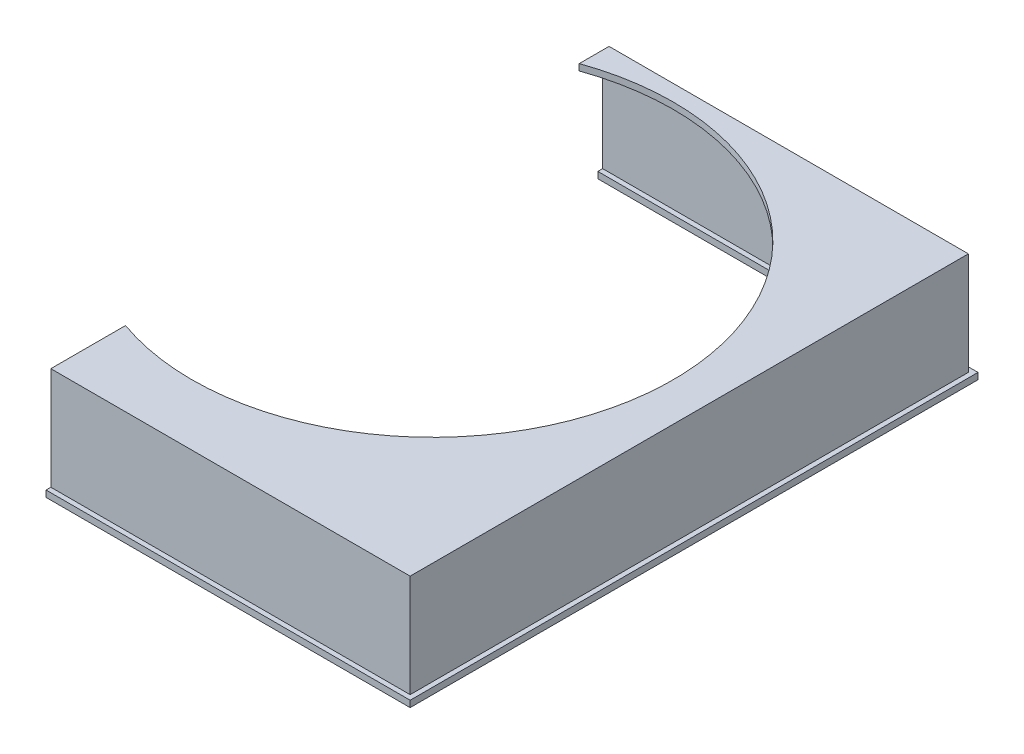
ISO-10303-21;
HEADER;
FILE_DESCRIPTION(('STEP AP214'),'2;1');
FILE_NAME('part.step','',(''),(''),'','','');
FILE_SCHEMA(('AUTOMOTIVE_DESIGN { 1 0 10303 214 1 1 1 1 }'));
ENDSEC;
DATA;
#1=APPLICATION_CONTEXT('core data for automotive mechanical design processes');
#2=APPLICATION_PROTOCOL_DEFINITION('international standard','automotive_design',2000,#1);
#3=PRODUCT_CONTEXT('',#1,'mechanical');
#4=PRODUCT('Part','Part','',(#3));
#5=PRODUCT_RELATED_PRODUCT_CATEGORY('part','',(#4));
#6=PRODUCT_DEFINITION_FORMATION('','',#4);
#7=PRODUCT_DEFINITION_CONTEXT('part definition',#1,'design');
#8=PRODUCT_DEFINITION('design','',#6,#7);
#9=PRODUCT_DEFINITION_SHAPE('','',#8);
#10=(LENGTH_UNIT() NAMED_UNIT(*) SI_UNIT(.MILLI.,.METRE.));
#11=(NAMED_UNIT(*) PLANE_ANGLE_UNIT() SI_UNIT($,.RADIAN.));
#12=(NAMED_UNIT(*) SI_UNIT($,.STERADIAN.) SOLID_ANGLE_UNIT());
#13=UNCERTAINTY_MEASURE_WITH_UNIT(LENGTH_MEASURE(1.E-05),#10,'distance_accuracy_value','');
#14=(GEOMETRIC_REPRESENTATION_CONTEXT(3) GLOBAL_UNCERTAINTY_ASSIGNED_CONTEXT((#13)) GLOBAL_UNIT_ASSIGNED_CONTEXT((#10,
#11,#12)) REPRESENTATION_CONTEXT('',''));
#15=CARTESIAN_POINT('',(0.,0.,0.));
#16=DIRECTION('',(0.,0.,1.));
#17=DIRECTION('',(1.,0.,0.));
#18=AXIS2_PLACEMENT_3D('',#15,#16,#17);
#19=CARTESIAN_POINT('',(0.,32.,170.));
#20=DIRECTION('',(0.,0.,-1.));
#21=DIRECTION('',(-1.,0.,0.));
#22=AXIS2_PLACEMENT_3D('',#19,#20,#21);
#23=PLANE('',#22);
#24=DIRECTION('',(0.,-1.,0.));
#25=VECTOR('',#24,1.);
#26=CARTESIAN_POINT('',(110.,32.,170.));
#27=LINE('',#26,#25);
#28=CARTESIAN_POINT('',(110.,30.,170.));
#29=VERTEX_POINT('',#28);
#30=CARTESIAN_POINT('',(110.,0.,170.));
#31=VERTEX_POINT('',#30);
#32=EDGE_CURVE('E312',#29,#31,#27,.T.);
#33=ORIENTED_EDGE('',*,*,#32,.F.);
#34=DIRECTION('',(1.,0.,0.));
#35=VECTOR('',#34,1.);
#36=CARTESIAN_POINT('',(-2.,30.,170.));
#37=LINE('',#36,#35);
#38=CARTESIAN_POINT('',(220.,30.,170.));
#39=VERTEX_POINT('',#38);
#40=EDGE_CURVE('E260',#29,#39,#37,.T.);
#41=ORIENTED_EDGE('',*,*,#40,.T.);
#42=DIRECTION('',(0.,-1.,0.));
#43=VECTOR('',#42,1.);
#44=CARTESIAN_POINT('',(220.,32.,170.));
#45=LINE('',#44,#43);
#46=CARTESIAN_POINT('',(220.,0.,170.));
#47=VERTEX_POINT('',#46);
#48=EDGE_CURVE('E218',#39,#47,#45,.T.);
#49=ORIENTED_EDGE('',*,*,#48,.T.);
#50=DIRECTION('',(1.,0.,0.));
#51=VECTOR('',#50,1.);
#52=CARTESIAN_POINT('',(0.,0.,170.));
#53=LINE('',#52,#51);
#54=EDGE_CURVE('E207',#31,#47,#53,.T.);
#55=ORIENTED_EDGE('',*,*,#54,.F.);
#56=EDGE_LOOP('',(#33,#41,#49,#55));
#57=FACE_BOUND('',#56,.T.);
#58=ADVANCED_FACE('F39',(#57),#23,.T.);
#59=CARTESIAN_POINT('',(220.,32.,0.));
#60=DIRECTION('',(-1.,0.,0.));
#61=DIRECTION('',(0.,0.,1.));
#62=AXIS2_PLACEMENT_3D('',#59,#60,#61);
#63=PLANE('',#62);
#64=ORIENTED_EDGE('',*,*,#48,.F.);
#65=DIRECTION('',(0.,0.,-1.));
#66=VECTOR('',#65,1.);
#67=CARTESIAN_POINT('',(220.,30.,-2.));
#68=LINE('',#67,#66);
#69=CARTESIAN_POINT('',(220.,30.,0.));
#70=VERTEX_POINT('',#69);
#71=EDGE_CURVE('E267',#39,#70,#68,.T.);
#72=ORIENTED_EDGE('',*,*,#71,.T.);
#73=DIRECTION('',(0.,-1.,0.));
#74=VECTOR('',#73,1.);
#75=CARTESIAN_POINT('',(220.,32.,0.));
#76=LINE('',#75,#74);
#77=CARTESIAN_POINT('',(220.,0.,0.));
#78=VERTEX_POINT('',#77);
#79=EDGE_CURVE('E216',#70,#78,#76,.T.);
#80=ORIENTED_EDGE('',*,*,#79,.T.);
#81=DIRECTION('',(0.,0.,-1.));
#82=VECTOR('',#81,1.);
#83=CARTESIAN_POINT('',(220.,0.,0.));
#84=LINE('',#83,#82);
#85=EDGE_CURVE('E210',#47,#78,#84,.T.);
#86=ORIENTED_EDGE('',*,*,#85,.F.);
#87=EDGE_LOOP('',(#64,#72,#80,#86));
#88=FACE_BOUND('',#87,.T.);
#89=ADVANCED_FACE('F354',(#88),#63,.T.);
#90=CARTESIAN_POINT('',(0.,32.,0.));
#91=DIRECTION('',(0.,0.,1.));
#92=DIRECTION('',(1.,0.,0.));
#93=AXIS2_PLACEMENT_3D('',#90,#91,#92);
#94=PLANE('',#93);
#95=DIRECTION('',(0.,1.,0.));
#96=VECTOR('',#95,1.);
#97=CARTESIAN_POINT('',(110.,32.,0.));
#98=LINE('',#97,#96);
#99=CARTESIAN_POINT('',(110.,0.,0.));
#100=VERTEX_POINT('',#99);
#101=CARTESIAN_POINT('',(110.,30.,0.));
#102=VERTEX_POINT('',#101);
#103=EDGE_CURVE('E304',#100,#102,#98,.T.);
#104=ORIENTED_EDGE('',*,*,#103,.F.);
#105=DIRECTION('',(-1.,0.,0.));
#106=VECTOR('',#105,1.);
#107=CARTESIAN_POINT('',(0.,0.,0.));
#108=LINE('',#107,#106);
#109=EDGE_CURVE('E213',#78,#100,#108,.T.);
#110=ORIENTED_EDGE('',*,*,#109,.F.);
#111=ORIENTED_EDGE('',*,*,#79,.F.);
#112=DIRECTION('',(-1.,0.,0.));
#113=VECTOR('',#112,1.);
#114=CARTESIAN_POINT('',(0.,30.,0.));
#115=LINE('',#114,#113);
#116=EDGE_CURVE('E242',#70,#102,#115,.T.);
#117=ORIENTED_EDGE('',*,*,#116,.T.);
#118=EDGE_LOOP('',(#104,#110,#111,#117));
#119=FACE_BOUND('',#118,.T.);
#120=ADVANCED_FACE('F351',(#119),#94,.T.);
#121=CARTESIAN_POINT('',(0.,32.,0.));
#122=DIRECTION('',(0.,1.,0.));
#123=DIRECTION('',(0.,0.,1.));
#124=AXIS2_PLACEMENT_3D('',#121,#122,#123);
#125=PLANE('',#124);
#126=DIRECTION('',(0.,0.,-1.));
#127=VECTOR('',#126,1.);
#128=CARTESIAN_POINT('',(110.,32.,-3.5));
#129=LINE('',#128,#127);
#130=CARTESIAN_POINT('',(110.,32.,172.));
#131=VERTEX_POINT('',#130);
#132=CARTESIAN_POINT('',(110.,32.,148.710678118655));
#133=VERTEX_POINT('',#132);
#134=EDGE_CURVE('E54',#131,#133,#129,.T.);
#135=ORIENTED_EDGE('',*,*,#134,.F.);
#136=DIRECTION('',(1.,0.,0.));
#137=VECTOR('',#136,1.);
#138=CARTESIAN_POINT('',(-2.,32.,172.));
#139=LINE('',#138,#137);
#140=CARTESIAN_POINT('',(222.,32.,172.));
#141=VERTEX_POINT('',#140);
#142=EDGE_CURVE('E222',#131,#141,#139,.T.);
#143=ORIENTED_EDGE('',*,*,#142,.T.);
#144=DIRECTION('',(0.,0.,-1.));
#145=VECTOR('',#144,1.);
#146=CARTESIAN_POINT('',(222.,32.,-2.));
#147=LINE('',#146,#145);
#148=CARTESIAN_POINT('',(222.,32.,-2.));
#149=VERTEX_POINT('',#148);
#150=EDGE_CURVE('E224',#141,#149,#147,.T.);
#151=ORIENTED_EDGE('',*,*,#150,.T.);
#152=DIRECTION('',(-1.,0.,0.));
#153=VECTOR('',#152,1.);
#154=CARTESIAN_POINT('',(-2.,32.,-2.));
#155=LINE('',#154,#153);
#156=CARTESIAN_POINT('',(110.,32.,-2.));
#157=VERTEX_POINT('',#156);
#158=EDGE_CURVE('E227',#149,#157,#155,.T.);
#159=ORIENTED_EDGE('',*,*,#158,.T.);
#160=CARTESIAN_POINT('',(110.,32.,7.28932188134522));
#161=VERTEX_POINT('',#160);
#162=EDGE_CURVE('E257',#161,#157,#129,.T.);
#163=ORIENTED_EDGE('',*,*,#162,.F.);
#164=CARTESIAN_POINT('',(135.,32.,78.));
#165=DIRECTION('',(0.,1.,0.));
#166=DIRECTION('',(0.,0.,1.));
#167=AXIS2_PLACEMENT_3D('',#164,#165,#166);
#168=CIRCLE('',#167,75.);
#169=EDGE_CURVE('E249',#133,#161,#168,.T.);
#170=ORIENTED_EDGE('',*,*,#169,.F.);
#171=EDGE_LOOP('',(#135,#143,#151,#159,#163,#170));
#172=FACE_BOUND('',#171,.T.);
#173=ADVANCED_FACE('F255',(#172),#125,.T.);
#174=CARTESIAN_POINT('',(-2.,32.,172.));
#175=DIRECTION('',(0.,0.,-1.));
#176=DIRECTION('',(-1.,0.,0.));
#177=AXIS2_PLACEMENT_3D('',#174,#175,#176);
#178=PLANE('',#177);
#179=ORIENTED_EDGE('',*,*,#142,.F.);
#180=DIRECTION('',(0.,-1.,0.));
#181=VECTOR('',#180,1.);
#182=CARTESIAN_POINT('',(110.,32.,172.));
#183=LINE('',#182,#181);
#184=CARTESIAN_POINT('',(110.,0.,172.));
#185=VERTEX_POINT('',#184);
#186=EDGE_CURVE('E258',#131,#185,#183,.T.);
#187=ORIENTED_EDGE('',*,*,#186,.T.);
#188=DIRECTION('',(1.,0.,0.));
#189=VECTOR('',#188,1.);
#190=CARTESIAN_POINT('',(-2.,0.,172.));
#191=LINE('',#190,#189);
#192=CARTESIAN_POINT('',(222.,0.,172.));
#193=VERTEX_POINT('',#192);
#194=EDGE_CURVE('E221',#185,#193,#191,.T.);
#195=ORIENTED_EDGE('',*,*,#194,.T.);
#196=DIRECTION('',(0.,-1.,0.));
#197=VECTOR('',#196,1.);
#198=CARTESIAN_POINT('',(222.,32.,172.));
#199=LINE('',#198,#197);
#200=EDGE_CURVE('E239',#141,#193,#199,.T.);
#201=ORIENTED_EDGE('',*,*,#200,.F.);
#202=EDGE_LOOP('',(#179,#187,#195,#201));
#203=FACE_BOUND('',#202,.T.);
#204=ADVANCED_FACE('F41',(#203),#178,.F.);
#205=CARTESIAN_POINT('',(222.,32.,-2.));
#206=DIRECTION('',(-1.,0.,0.));
#207=DIRECTION('',(0.,0.,1.));
#208=AXIS2_PLACEMENT_3D('',#205,#206,#207);
#209=PLANE('',#208);
#210=DIRECTION('',(0.,0.,-1.));
#211=VECTOR('',#210,1.);
#212=CARTESIAN_POINT('',(222.,0.,-2.));
#213=LINE('',#212,#211);
#214=CARTESIAN_POINT('',(222.,0.,-2.));
#215=VERTEX_POINT('',#214);
#216=EDGE_CURVE('E232',#193,#215,#213,.T.);
#217=ORIENTED_EDGE('',*,*,#216,.T.);
#218=DIRECTION('',(0.,-1.,0.));
#219=VECTOR('',#218,1.);
#220=CARTESIAN_POINT('',(222.,32.,-2.));
#221=LINE('',#220,#219);
#222=EDGE_CURVE('E230',#149,#215,#221,.T.);
#223=ORIENTED_EDGE('',*,*,#222,.F.);
#224=ORIENTED_EDGE('',*,*,#150,.F.);
#225=ORIENTED_EDGE('',*,*,#200,.T.);
#226=EDGE_LOOP('',(#217,#223,#224,#225));
#227=FACE_BOUND('',#226,.T.);
#228=ADVANCED_FACE('F342',(#227),#209,.F.);
#229=CARTESIAN_POINT('',(-2.,32.,-2.));
#230=DIRECTION('',(0.,0.,1.));
#231=DIRECTION('',(1.,0.,0.));
#232=AXIS2_PLACEMENT_3D('',#229,#230,#231);
#233=PLANE('',#232);
#234=DIRECTION('',(-1.,0.,0.));
#235=VECTOR('',#234,1.);
#236=CARTESIAN_POINT('',(-2.,0.,-2.));
#237=LINE('',#236,#235);
#238=CARTESIAN_POINT('',(110.,0.,-2.));
#239=VERTEX_POINT('',#238);
#240=EDGE_CURVE('E225',#215,#239,#237,.T.);
#241=ORIENTED_EDGE('',*,*,#240,.T.);
#242=DIRECTION('',(0.,1.,0.));
#243=VECTOR('',#242,1.);
#244=CARTESIAN_POINT('',(110.,32.,-2.));
#245=LINE('',#244,#243);
#246=EDGE_CURVE('E332',#239,#157,#245,.T.);
#247=ORIENTED_EDGE('',*,*,#246,.T.);
#248=ORIENTED_EDGE('',*,*,#158,.F.);
#249=ORIENTED_EDGE('',*,*,#222,.T.);
#250=EDGE_LOOP('',(#241,#247,#248,#249));
#251=FACE_BOUND('',#250,.T.);
#252=ADVANCED_FACE('F337',(#251),#233,.F.);
#253=CARTESIAN_POINT('',(0.,0.,0.));
#254=DIRECTION('',(0.,1.,0.));
#255=DIRECTION('',(0.,0.,1.));
#256=AXIS2_PLACEMENT_3D('',#253,#254,#255);
#257=PLANE('',#256);
#258=DIRECTION('',(0.,0.,-1.));
#259=VECTOR('',#258,1.);
#260=CARTESIAN_POINT('',(110.,0.,0.));
#261=LINE('',#260,#259);
#262=CARTESIAN_POINT('',(110.,0.,173.5));
#263=VERTEX_POINT('',#262);
#264=EDGE_CURVE('E263',#263,#185,#261,.T.);
#265=ORIENTED_EDGE('',*,*,#264,.F.);
#266=DIRECTION('',(1.,0.,0.));
#267=VECTOR('',#266,1.);
#268=CARTESIAN_POINT('',(-3.5,0.,173.5));
#269=LINE('',#268,#267);
#270=CARTESIAN_POINT('',(223.5,0.,173.5));
#271=VERTEX_POINT('',#270);
#272=EDGE_CURVE('E179',#263,#271,#269,.T.);
#273=ORIENTED_EDGE('',*,*,#272,.T.);
#274=DIRECTION('',(0.,0.,-1.));
#275=VECTOR('',#274,1.);
#276=CARTESIAN_POINT('',(223.5,0.,-3.5));
#277=LINE('',#276,#275);
#278=CARTESIAN_POINT('',(223.5,0.,-3.5));
#279=VERTEX_POINT('',#278);
#280=EDGE_CURVE('E192',#271,#279,#277,.T.);
#281=ORIENTED_EDGE('',*,*,#280,.T.);
#282=DIRECTION('',(-1.,0.,0.));
#283=VECTOR('',#282,1.);
#284=CARTESIAN_POINT('',(-3.5,0.,-3.5));
#285=LINE('',#284,#283);
#286=CARTESIAN_POINT('',(110.,0.,-3.5));
#287=VERTEX_POINT('',#286);
#288=EDGE_CURVE('E187',#279,#287,#285,.T.);
#289=ORIENTED_EDGE('',*,*,#288,.T.);
#290=EDGE_CURVE('E307',#239,#287,#261,.T.);
#291=ORIENTED_EDGE('',*,*,#290,.F.);
#292=ORIENTED_EDGE('',*,*,#240,.F.);
#293=ORIENTED_EDGE('',*,*,#216,.F.);
#294=ORIENTED_EDGE('',*,*,#194,.F.);
#295=EDGE_LOOP('',(#265,#273,#281,#289,#291,#292,#293,#294));
#296=FACE_BOUND('',#295,.T.);
#297=ADVANCED_FACE('F328',(#296),#257,.T.);
#298=CARTESIAN_POINT('',(-3.5,-2.,-3.5));
#299=DIRECTION('',(0.,0.,-1.));
#300=DIRECTION('',(-1.,0.,0.));
#301=AXIS2_PLACEMENT_3D('',#298,#299,#300);
#302=PLANE('',#301);
#303=DIRECTION('',(0.,1.,0.));
#304=VECTOR('',#303,1.);
#305=CARTESIAN_POINT('',(110.,-2.,-3.5));
#306=LINE('',#305,#304);
#307=CARTESIAN_POINT('',(110.,-2.,-3.5));
#308=VERTEX_POINT('',#307);
#309=EDGE_CURVE('E180',#308,#287,#306,.T.);
#310=ORIENTED_EDGE('',*,*,#309,.T.);
#311=ORIENTED_EDGE('',*,*,#288,.F.);
#312=DIRECTION('',(0.,1.,0.));
#313=VECTOR('',#312,1.);
#314=CARTESIAN_POINT('',(223.5,-2.,-3.5));
#315=LINE('',#314,#313);
#316=CARTESIAN_POINT('',(223.5,-2.,-3.5));
#317=VERTEX_POINT('',#316);
#318=EDGE_CURVE('E205',#317,#279,#315,.T.);
#319=ORIENTED_EDGE('',*,*,#318,.F.);
#320=DIRECTION('',(-1.,0.,0.));
#321=VECTOR('',#320,1.);
#322=CARTESIAN_POINT('',(-3.5,-2.,-3.5));
#323=LINE('',#322,#321);
#324=EDGE_CURVE('E189',#317,#308,#323,.T.);
#325=ORIENTED_EDGE('',*,*,#324,.T.);
#326=EDGE_LOOP('',(#310,#311,#319,#325));
#327=FACE_BOUND('',#326,.T.);
#328=ADVANCED_FACE('F322',(#327),#302,.T.);
#329=CARTESIAN_POINT('',(223.5,-2.,-3.5));
#330=DIRECTION('',(1.,0.,0.));
#331=DIRECTION('',(0.,0.,-1.));
#332=AXIS2_PLACEMENT_3D('',#329,#330,#331);
#333=PLANE('',#332);
#334=ORIENTED_EDGE('',*,*,#280,.F.);
#335=DIRECTION('',(0.,1.,0.));
#336=VECTOR('',#335,1.);
#337=CARTESIAN_POINT('',(223.5,-2.,173.5));
#338=LINE('',#337,#336);
#339=CARTESIAN_POINT('',(223.5,-2.,173.5));
#340=VERTEX_POINT('',#339);
#341=EDGE_CURVE('E200',#340,#271,#338,.T.);
#342=ORIENTED_EDGE('',*,*,#341,.F.);
#343=DIRECTION('',(0.,0.,-1.));
#344=VECTOR('',#343,1.);
#345=CARTESIAN_POINT('',(223.5,-2.,-3.5));
#346=LINE('',#345,#344);
#347=EDGE_CURVE('E186',#340,#317,#346,.T.);
#348=ORIENTED_EDGE('',*,*,#347,.T.);
#349=ORIENTED_EDGE('',*,*,#318,.T.);
#350=EDGE_LOOP('',(#334,#342,#348,#349));
#351=FACE_BOUND('',#350,.T.);
#352=ADVANCED_FACE('F326',(#351),#333,.T.);
#353=CARTESIAN_POINT('',(-3.5,-2.,173.5));
#354=DIRECTION('',(0.,0.,1.));
#355=DIRECTION('',(1.,0.,0.));
#356=AXIS2_PLACEMENT_3D('',#353,#354,#355);
#357=PLANE('',#356);
#358=DIRECTION('',(0.,1.,0.));
#359=VECTOR('',#358,1.);
#360=CARTESIAN_POINT('',(110.,-2.,173.5));
#361=LINE('',#360,#359);
#362=CARTESIAN_POINT('',(110.,-2.,173.5));
#363=VERTEX_POINT('',#362);
#364=EDGE_CURVE('E164',#363,#263,#361,.T.);
#365=ORIENTED_EDGE('',*,*,#364,.F.);
#366=DIRECTION('',(1.,0.,0.));
#367=VECTOR('',#366,1.);
#368=CARTESIAN_POINT('',(-3.5,-2.,173.5));
#369=LINE('',#368,#367);
#370=EDGE_CURVE('E177',#363,#340,#369,.T.);
#371=ORIENTED_EDGE('',*,*,#370,.T.);
#372=ORIENTED_EDGE('',*,*,#341,.T.);
#373=ORIENTED_EDGE('',*,*,#272,.F.);
#374=EDGE_LOOP('',(#365,#371,#372,#373));
#375=FACE_BOUND('',#374,.T.);
#376=ADVANCED_FACE('F175',(#375),#357,.T.);
#377=CARTESIAN_POINT('',(0.,-2.,0.));
#378=DIRECTION('',(0.,1.,0.));
#379=DIRECTION('',(0.,0.,1.));
#380=AXIS2_PLACEMENT_3D('',#377,#378,#379);
#381=PLANE('',#380);
#382=ORIENTED_EDGE('',*,*,#370,.F.);
#383=DIRECTION('',(0.,0.,-1.));
#384=VECTOR('',#383,1.);
#385=CARTESIAN_POINT('',(110.,-2.,-3.5));
#386=LINE('',#385,#384);
#387=CARTESIAN_POINT('',(110.,-2.,168.5));
#388=VERTEX_POINT('',#387);
#389=EDGE_CURVE('E161',#363,#388,#386,.T.);
#390=ORIENTED_EDGE('',*,*,#389,.T.);
#391=DIRECTION('',(1.,0.,0.));
#392=VECTOR('',#391,1.);
#393=CARTESIAN_POINT('',(218.5,-2.,168.5));
#394=LINE('',#393,#392);
#395=CARTESIAN_POINT('',(218.5,-2.,168.5));
#396=VERTEX_POINT('',#395);
#397=EDGE_CURVE('E278',#388,#396,#394,.T.);
#398=ORIENTED_EDGE('',*,*,#397,.T.);
#399=DIRECTION('',(0.,0.,-1.));
#400=VECTOR('',#399,1.);
#401=CARTESIAN_POINT('',(218.5,-2.,168.5));
#402=LINE('',#401,#400);
#403=CARTESIAN_POINT('',(218.5,-2.,1.5));
#404=VERTEX_POINT('',#403);
#405=EDGE_CURVE('E271',#396,#404,#402,.T.);
#406=ORIENTED_EDGE('',*,*,#405,.T.);
#407=DIRECTION('',(-1.,0.,0.));
#408=VECTOR('',#407,1.);
#409=CARTESIAN_POINT('',(218.5,-2.,1.5));
#410=LINE('',#409,#408);
#411=CARTESIAN_POINT('',(110.,-2.,1.5));
#412=VERTEX_POINT('',#411);
#413=EDGE_CURVE('E274',#404,#412,#410,.T.);
#414=ORIENTED_EDGE('',*,*,#413,.T.);
#415=EDGE_CURVE('E171',#412,#308,#386,.T.);
#416=ORIENTED_EDGE('',*,*,#415,.T.);
#417=ORIENTED_EDGE('',*,*,#324,.F.);
#418=ORIENTED_EDGE('',*,*,#347,.F.);
#419=EDGE_LOOP('',(#382,#390,#398,#406,#414,#416,#417,#418));
#420=FACE_BOUND('',#419,.T.);
#421=ADVANCED_FACE('F183',(#420),#381,.F.);
#422=DIRECTION('',(0.,0.,-1.));
#423=VECTOR('',#422,1.);
#424=CARTESIAN_POINT('',(110.,0.,0.));
#425=LINE('',#424,#423);
#426=CARTESIAN_POINT('',(110.,0.,168.5));
#427=VERTEX_POINT('',#426);
#428=EDGE_CURVE('E306',#31,#427,#425,.T.);
#429=ORIENTED_EDGE('',*,*,#428,.F.);
#430=ORIENTED_EDGE('',*,*,#54,.T.);
#431=ORIENTED_EDGE('',*,*,#85,.T.);
#432=ORIENTED_EDGE('',*,*,#109,.T.);
#433=CARTESIAN_POINT('',(110.,0.,1.5));
#434=VERTEX_POINT('',#433);
#435=EDGE_CURVE('E300',#434,#100,#425,.T.);
#436=ORIENTED_EDGE('',*,*,#435,.F.);
#437=DIRECTION('',(-1.,0.,0.));
#438=VECTOR('',#437,1.);
#439=CARTESIAN_POINT('',(218.5,0.,1.5));
#440=LINE('',#439,#438);
#441=CARTESIAN_POINT('',(218.5,0.,1.5));
#442=VERTEX_POINT('',#441);
#443=EDGE_CURVE('E281',#442,#434,#440,.T.);
#444=ORIENTED_EDGE('',*,*,#443,.F.);
#445=DIRECTION('',(0.,0.,-1.));
#446=VECTOR('',#445,1.);
#447=CARTESIAN_POINT('',(218.5,0.,168.5));
#448=LINE('',#447,#446);
#449=CARTESIAN_POINT('',(218.5,0.,168.5));
#450=VERTEX_POINT('',#449);
#451=EDGE_CURVE('E270',#450,#442,#448,.T.);
#452=ORIENTED_EDGE('',*,*,#451,.F.);
#453=DIRECTION('',(1.,0.,0.));
#454=VECTOR('',#453,1.);
#455=CARTESIAN_POINT('',(218.5,0.,168.5));
#456=LINE('',#455,#454);
#457=EDGE_CURVE('E275',#427,#450,#456,.T.);
#458=ORIENTED_EDGE('',*,*,#457,.F.);
#459=EDGE_LOOP('',(#429,#430,#431,#432,#436,#444,#452,#458));
#460=FACE_BOUND('',#459,.T.);
#461=ADVANCED_FACE('F298',(#460),#257,.T.);
#462=CARTESIAN_POINT('',(218.5,-2.,168.5));
#463=DIRECTION('',(1.,0.,0.));
#464=DIRECTION('',(0.,0.,-1.));
#465=AXIS2_PLACEMENT_3D('',#462,#463,#464);
#466=PLANE('',#465);
#467=ORIENTED_EDGE('',*,*,#451,.T.);
#468=DIRECTION('',(0.,1.,0.));
#469=VECTOR('',#468,1.);
#470=CARTESIAN_POINT('',(218.5,-2.,1.5));
#471=LINE('',#470,#469);
#472=EDGE_CURVE('E195',#404,#442,#471,.T.);
#473=ORIENTED_EDGE('',*,*,#472,.F.);
#474=ORIENTED_EDGE('',*,*,#405,.F.);
#475=DIRECTION('',(0.,1.,0.));
#476=VECTOR('',#475,1.);
#477=CARTESIAN_POINT('',(218.5,-2.,168.5));
#478=LINE('',#477,#476);
#479=EDGE_CURVE('E202',#396,#450,#478,.T.);
#480=ORIENTED_EDGE('',*,*,#479,.T.);
#481=EDGE_LOOP('',(#467,#473,#474,#480));
#482=FACE_BOUND('',#481,.T.);
#483=ADVANCED_FACE('F376',(#482),#466,.F.);
#484=CARTESIAN_POINT('',(218.5,-2.,168.5));
#485=DIRECTION('',(0.,0.,1.));
#486=DIRECTION('',(1.,0.,0.));
#487=AXIS2_PLACEMENT_3D('',#484,#485,#486);
#488=PLANE('',#487);
#489=ORIENTED_EDGE('',*,*,#397,.F.);
#490=DIRECTION('',(0.,1.,0.));
#491=VECTOR('',#490,1.);
#492=CARTESIAN_POINT('',(110.,-2.,168.5));
#493=LINE('',#492,#491);
#494=EDGE_CURVE('E167',#388,#427,#493,.T.);
#495=ORIENTED_EDGE('',*,*,#494,.T.);
#496=ORIENTED_EDGE('',*,*,#457,.T.);
#497=ORIENTED_EDGE('',*,*,#479,.F.);
#498=EDGE_LOOP('',(#489,#495,#496,#497));
#499=FACE_BOUND('',#498,.T.);
#500=ADVANCED_FACE('F382',(#499),#488,.F.);
#501=CARTESIAN_POINT('',(218.5,-2.,1.5));
#502=DIRECTION('',(0.,0.,-1.));
#503=DIRECTION('',(-1.,0.,0.));
#504=AXIS2_PLACEMENT_3D('',#501,#502,#503);
#505=PLANE('',#504);
#506=ORIENTED_EDGE('',*,*,#443,.T.);
#507=DIRECTION('',(0.,-1.,0.));
#508=VECTOR('',#507,1.);
#509=CARTESIAN_POINT('',(110.,-2.,1.5));
#510=LINE('',#509,#508);
#511=EDGE_CURVE('E303',#434,#412,#510,.T.);
#512=ORIENTED_EDGE('',*,*,#511,.T.);
#513=ORIENTED_EDGE('',*,*,#413,.F.);
#514=ORIENTED_EDGE('',*,*,#472,.T.);
#515=EDGE_LOOP('',(#506,#512,#513,#514));
#516=FACE_BOUND('',#515,.T.);
#517=ADVANCED_FACE('F293',(#516),#505,.F.);
#518=CARTESIAN_POINT('',(0.,30.,0.));
#519=DIRECTION('',(0.,1.,0.));
#520=DIRECTION('',(0.,0.,1.));
#521=AXIS2_PLACEMENT_3D('',#518,#519,#520);
#522=PLANE('',#521);
#523=ORIENTED_EDGE('',*,*,#40,.F.);
#524=DIRECTION('',(0.,0.,-1.));
#525=VECTOR('',#524,1.);
#526=CARTESIAN_POINT('',(110.,30.,0.));
#527=LINE('',#526,#525);
#528=CARTESIAN_POINT('',(110.,30.,148.710678118655));
#529=VERTEX_POINT('',#528);
#530=EDGE_CURVE('E313',#29,#529,#527,.T.);
#531=ORIENTED_EDGE('',*,*,#530,.T.);
#532=CARTESIAN_POINT('',(135.,30.,78.));
#533=DIRECTION('',(0.,1.,0.));
#534=DIRECTION('',(0.,0.,1.));
#535=AXIS2_PLACEMENT_3D('',#532,#533,#534);
#536=CIRCLE('',#535,75.);
#537=CARTESIAN_POINT('',(110.,30.,7.28932188134522));
#538=VERTEX_POINT('',#537);
#539=EDGE_CURVE('E251',#529,#538,#536,.T.);
#540=ORIENTED_EDGE('',*,*,#539,.T.);
#541=EDGE_CURVE('E62',#538,#102,#527,.T.);
#542=ORIENTED_EDGE('',*,*,#541,.T.);
#543=ORIENTED_EDGE('',*,*,#116,.F.);
#544=ORIENTED_EDGE('',*,*,#71,.F.);
#545=EDGE_LOOP('',(#523,#531,#540,#542,#543,#544));
#546=FACE_BOUND('',#545,.T.);
#547=ADVANCED_FACE('F391',(#546),#522,.F.);
#548=CARTESIAN_POINT('',(135.,30.,78.));
#549=DIRECTION('',(0.,1.,0.));
#550=DIRECTION('',(0.,0.,1.));
#551=AXIS2_PLACEMENT_3D('',#548,#549,#550);
#552=CYLINDRICAL_SURFACE('',#551,75.);
#553=ORIENTED_EDGE('',*,*,#169,.T.);
#554=DIRECTION('',(0.,1.,0.));
#555=VECTOR('',#554,1.);
#556=CARTESIAN_POINT('',(110.,30.,7.28932188134522));
#557=LINE('',#556,#555);
#558=EDGE_CURVE('E11',#161,#538,#557,.F.);
#559=ORIENTED_EDGE('',*,*,#558,.T.);
#560=ORIENTED_EDGE('',*,*,#539,.F.);
#561=DIRECTION('',(0.,1.,0.));
#562=VECTOR('',#561,1.);
#563=CARTESIAN_POINT('',(110.,30.,148.710678118655));
#564=LINE('',#563,#562);
#565=EDGE_CURVE('E47',#529,#133,#564,.T.);
#566=ORIENTED_EDGE('',*,*,#565,.T.);
#567=EDGE_LOOP('',(#553,#559,#560,#566));
#568=FACE_BOUND('',#567,.T.);
#569=ADVANCED_FACE('F248',(#568),#552,.F.);
#570=CARTESIAN_POINT('',(110.,-2.,-3.5));
#571=DIRECTION('',(1.,0.,0.));
#572=DIRECTION('',(0.,0.,-1.));
#573=AXIS2_PLACEMENT_3D('',#570,#571,#572);
#574=PLANE('',#573);
#575=ORIENTED_EDGE('',*,*,#134,.T.);
#576=ORIENTED_EDGE('',*,*,#565,.F.);
#577=ORIENTED_EDGE('',*,*,#530,.F.);
#578=ORIENTED_EDGE('',*,*,#32,.T.);
#579=ORIENTED_EDGE('',*,*,#428,.T.);
#580=ORIENTED_EDGE('',*,*,#494,.F.);
#581=ORIENTED_EDGE('',*,*,#389,.F.);
#582=ORIENTED_EDGE('',*,*,#364,.T.);
#583=ORIENTED_EDGE('',*,*,#264,.T.);
#584=ORIENTED_EDGE('',*,*,#186,.F.);
#585=EDGE_LOOP('',(#575,#576,#577,#578,#579,#580,#581,#582,#583,#584));
#586=FACE_BOUND('',#585,.T.);
#587=ADVANCED_FACE('F163',(#586),#574,.F.);
#588=ORIENTED_EDGE('',*,*,#290,.T.);
#589=ORIENTED_EDGE('',*,*,#309,.F.);
#590=ORIENTED_EDGE('',*,*,#415,.F.);
#591=ORIENTED_EDGE('',*,*,#511,.F.);
#592=ORIENTED_EDGE('',*,*,#435,.T.);
#593=ORIENTED_EDGE('',*,*,#103,.T.);
#594=ORIENTED_EDGE('',*,*,#541,.F.);
#595=ORIENTED_EDGE('',*,*,#558,.F.);
#596=ORIENTED_EDGE('',*,*,#162,.T.);
#597=ORIENTED_EDGE('',*,*,#246,.F.);
#598=EDGE_LOOP('',(#588,#589,#590,#591,#592,#593,#594,#595,#596,#597));
#599=FACE_BOUND('',#598,.T.);
#600=ADVANCED_FACE('F335',(#599),#574,.F.);
#601=CLOSED_SHELL('',(#58,#89,#120,#173,#204,#228,#252,#297,#328,#352,#376,#421,#461,#483,#500,
#517,#547,#569,#587,#600));
#602=MANIFOLD_SOLID_BREP('B2',#601);
#603=ADVANCED_BREP_SHAPE_REPRESENTATION('',(#18,#602),#14);
#604=SHAPE_DEFINITION_REPRESENTATION(#9,#603);
ENDSEC;
END-ISO-10303-21;
